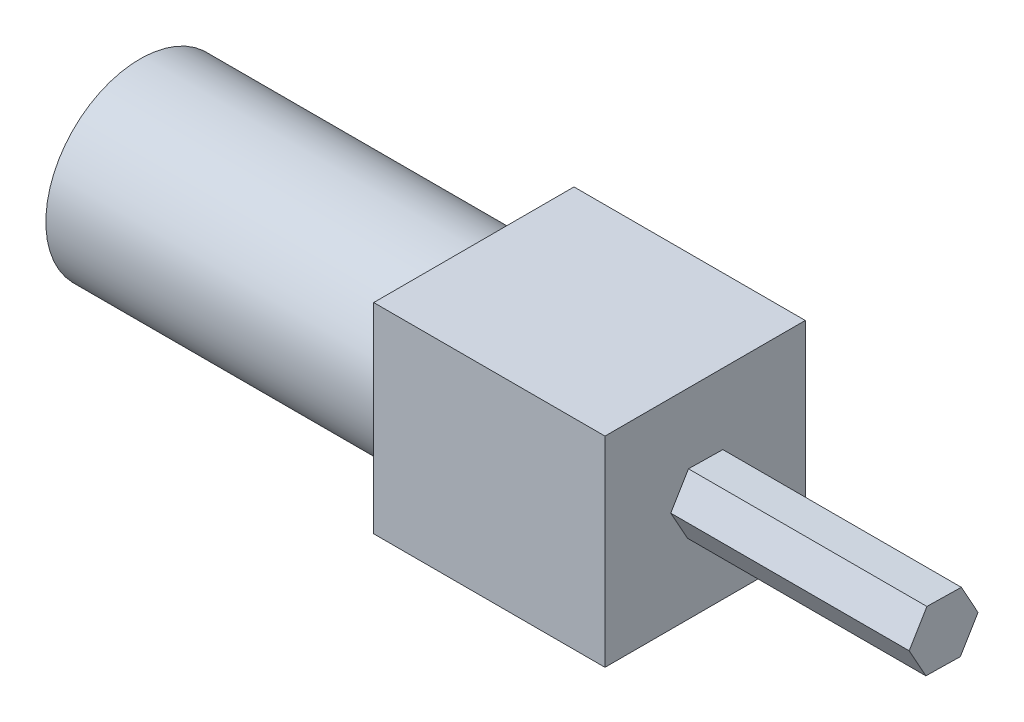
ISO-10303-21;
HEADER;
FILE_DESCRIPTION(('STEP AP214'),'2;1');
FILE_NAME('part.step','',(''),(''),'','','');
FILE_SCHEMA(('AUTOMOTIVE_DESIGN { 1 0 10303 214 1 1 1 1 }'));
ENDSEC;
DATA;
#1=APPLICATION_CONTEXT('core data for automotive mechanical design processes');
#2=APPLICATION_PROTOCOL_DEFINITION('international standard','automotive_design',2000,#1);
#3=PRODUCT_CONTEXT('',#1,'mechanical');
#4=PRODUCT('Part','Part','',(#3));
#5=PRODUCT_RELATED_PRODUCT_CATEGORY('part','',(#4));
#6=PRODUCT_DEFINITION_FORMATION('','',#4);
#7=PRODUCT_DEFINITION_CONTEXT('part definition',#1,'design');
#8=PRODUCT_DEFINITION('design','',#6,#7);
#9=PRODUCT_DEFINITION_SHAPE('','',#8);
#10=(LENGTH_UNIT() NAMED_UNIT(*) SI_UNIT(.MILLI.,.METRE.));
#11=(NAMED_UNIT(*) PLANE_ANGLE_UNIT() SI_UNIT($,.RADIAN.));
#12=(NAMED_UNIT(*) SI_UNIT($,.STERADIAN.) SOLID_ANGLE_UNIT());
#13=UNCERTAINTY_MEASURE_WITH_UNIT(LENGTH_MEASURE(1.E-05),#10,'distance_accuracy_value','');
#14=(GEOMETRIC_REPRESENTATION_CONTEXT(3) GLOBAL_UNCERTAINTY_ASSIGNED_CONTEXT((#13)) GLOBAL_UNIT_ASSIGNED_CONTEXT((#10,
#11,#12)) REPRESENTATION_CONTEXT('',''));
#15=CARTESIAN_POINT('',(0.,0.,0.));
#16=DIRECTION('',(0.,0.,1.));
#17=DIRECTION('',(1.,0.,0.));
#18=AXIS2_PLACEMENT_3D('',#15,#16,#17);
#19=CARTESIAN_POINT('',(120.396,0.,0.));
#20=DIRECTION('',(1.,0.,0.));
#21=DIRECTION('',(0.,0.,-1.));
#22=AXIS2_PLACEMENT_3D('',#19,#20,#21);
#23=PLANE('',#22);
#24=DIRECTION('',(0.,1.,0.));
#25=VECTOR('',#24,1.);
#26=CARTESIAN_POINT('',(120.396,21.336,-21.336));
#27=LINE('',#26,#25);
#28=CARTESIAN_POINT('',(120.396,-21.336,-21.336));
#29=VERTEX_POINT('',#28);
#30=CARTESIAN_POINT('',(120.396,21.336,-21.336));
#31=VERTEX_POINT('',#30);
#32=EDGE_CURVE('E154',#29,#31,#27,.T.);
#33=ORIENTED_EDGE('',*,*,#32,.T.);
#34=DIRECTION('',(0.,0.,1.));
#35=VECTOR('',#34,1.);
#36=CARTESIAN_POINT('',(120.396,21.336,21.336));
#37=LINE('',#36,#35);
#38=CARTESIAN_POINT('',(120.396,21.336,21.336));
#39=VERTEX_POINT('',#38);
#40=EDGE_CURVE('E86',#31,#39,#37,.T.);
#41=ORIENTED_EDGE('',*,*,#40,.T.);
#42=DIRECTION('',(0.,-1.,0.));
#43=VECTOR('',#42,1.);
#44=CARTESIAN_POINT('',(120.396,21.336,21.336));
#45=LINE('',#44,#43);
#46=CARTESIAN_POINT('',(120.396,-21.336,21.336));
#47=VERTEX_POINT('',#46);
#48=EDGE_CURVE('E157',#39,#47,#45,.T.);
#49=ORIENTED_EDGE('',*,*,#48,.T.);
#50=DIRECTION('',(0.,0.,-1.));
#51=VECTOR('',#50,1.);
#52=CARTESIAN_POINT('',(120.396,-21.336,21.336));
#53=LINE('',#52,#51);
#54=EDGE_CURVE('E57',#47,#29,#53,.T.);
#55=ORIENTED_EDGE('',*,*,#54,.T.);
#56=EDGE_LOOP('',(#33,#41,#49,#55));
#57=FACE_BOUND('',#56,.T.);
#58=DIRECTION('',(0.,0.857282029056749,-0.514847086673649));
#59=VECTOR('',#58,1.);
#60=CARTESIAN_POINT('',(120.396,-6.4122242654483,-3.55622177358631));
#61=LINE('',#60,#59);
#62=CARTESIAN_POINT('',(120.396,-6.4122242654483,-3.55622177358631));
#63=VERTEX_POINT('',#62);
#64=CARTESIAN_POINT('',(120.396,-0.126333735307045,-7.33125999543439));
#65=VERTEX_POINT('',#64);
#66=EDGE_CURVE('E326',#63,#65,#61,.T.);
#67=ORIENTED_EDGE('',*,*,#66,.F.);
#68=DIRECTION('',(0.,-0.0172296415954146,-0.999851558707838));
#69=VECTOR('',#68,1.);
#70=CARTESIAN_POINT('',(120.396,-6.28589053014125,3.77503822184808));
#71=LINE('',#70,#69);
#72=CARTESIAN_POINT('',(120.396,-6.28589053014125,3.77503822184808));
#73=VERTEX_POINT('',#72);
#74=EDGE_CURVE('E143',#73,#63,#71,.T.);
#75=ORIENTED_EDGE('',*,*,#74,.F.);
#76=DIRECTION('',(0.,-0.874511670652163,-0.485004472034189));
#77=VECTOR('',#76,1.);
#78=CARTESIAN_POINT('',(120.396,0.126333735307046,7.33125999543439));
#79=LINE('',#78,#77);
#80=CARTESIAN_POINT('',(120.396,0.126333735307046,7.3312599954344));
#81=VERTEX_POINT('',#80);
#82=EDGE_CURVE('E139',#81,#73,#79,.T.);
#83=ORIENTED_EDGE('',*,*,#82,.F.);
#84=DIRECTION('',(0.,-0.857282029056749,0.514847086673649));
#85=VECTOR('',#84,1.);
#86=CARTESIAN_POINT('',(120.396,6.4122242654483,3.55622177358632));
#87=LINE('',#86,#85);
#88=CARTESIAN_POINT('',(120.396,6.4122242654483,3.55622177358632));
#89=VERTEX_POINT('',#88);
#90=EDGE_CURVE('E322',#89,#81,#87,.T.);
#91=ORIENTED_EDGE('',*,*,#90,.F.);
#92=DIRECTION('',(0.,0.0172296415954145,0.999851558707838));
#93=VECTOR('',#92,1.);
#94=CARTESIAN_POINT('',(120.396,6.28589053014125,-3.77503822184807));
#95=LINE('',#94,#93);
#96=CARTESIAN_POINT('',(120.396,6.28589053014125,-3.77503822184807));
#97=VERTEX_POINT('',#96);
#98=EDGE_CURVE('E334',#97,#89,#95,.T.);
#99=ORIENTED_EDGE('',*,*,#98,.F.);
#100=DIRECTION('',(0.,0.874511670652163,0.485004472034189));
#101=VECTOR('',#100,1.);
#102=CARTESIAN_POINT('',(120.396,-0.126333735307045,-7.33125999543439));
#103=LINE('',#102,#101);
#104=EDGE_CURVE('E328',#65,#97,#103,.T.);
#105=ORIENTED_EDGE('',*,*,#104,.F.);
#106=EDGE_LOOP('',(#67,#75,#83,#91,#99,#105));
#107=FACE_BOUND('',#106,.T.);
#108=ADVANCED_FACE('F33',(#57,#107),#23,.T.);
#109=CARTESIAN_POINT('',(71.12,0.,0.));
#110=DIRECTION('',(-1.,0.,0.));
#111=DIRECTION('',(0.,0.,1.));
#112=AXIS2_PLACEMENT_3D('',#109,#110,#111);
#113=CYLINDRICAL_SURFACE('',#112,20.066);
#114=CARTESIAN_POINT('',(71.12,0.,0.));
#115=DIRECTION('',(1.,0.,0.));
#116=DIRECTION('',(0.,0.,-1.));
#117=AXIS2_PLACEMENT_3D('',#114,#115,#116);
#118=CIRCLE('',#117,20.066);
#119=CARTESIAN_POINT('',(71.12,0.,-20.066));
#120=VERTEX_POINT('',#119);
#121=EDGE_CURVE('E11',#120,#120,#118,.T.);
#122=ORIENTED_EDGE('',*,*,#121,.F.);
#123=EDGE_LOOP('',(#122));
#124=FACE_BOUND('',#123,.T.);
#125=CARTESIAN_POINT('',(0.,0.,0.));
#126=DIRECTION('',(1.,0.,0.));
#127=DIRECTION('',(0.,0.,-1.));
#128=AXIS2_PLACEMENT_3D('',#125,#126,#127);
#129=CIRCLE('',#128,20.066);
#130=CARTESIAN_POINT('',(0.,0.,-20.066));
#131=VERTEX_POINT('',#130);
#132=EDGE_CURVE('E37',#131,#131,#129,.T.);
#133=ORIENTED_EDGE('',*,*,#132,.T.);
#134=EDGE_LOOP('',(#133));
#135=FACE_BOUND('',#134,.T.);
#136=ADVANCED_FACE('F35',(#124,#135),#113,.T.);
#137=CARTESIAN_POINT('',(0.,0.,0.));
#138=DIRECTION('',(1.,0.,0.));
#139=DIRECTION('',(0.,0.,-1.));
#140=AXIS2_PLACEMENT_3D('',#137,#138,#139);
#141=PLANE('',#140);
#142=ORIENTED_EDGE('',*,*,#132,.F.);
#143=EDGE_LOOP('',(#142));
#144=FACE_BOUND('',#143,.T.);
#145=ADVANCED_FACE('F177',(#144),#141,.F.);
#146=CARTESIAN_POINT('',(120.396,21.336,-21.336));
#147=DIRECTION('',(0.,0.,1.));
#148=DIRECTION('',(0.,-1.,0.));
#149=AXIS2_PLACEMENT_3D('',#146,#147,#148);
#150=PLANE('',#149);
#151=DIRECTION('',(0.,1.,0.));
#152=VECTOR('',#151,1.);
#153=CARTESIAN_POINT('',(71.12,21.336,-21.336));
#154=LINE('',#153,#152);
#155=CARTESIAN_POINT('',(71.12,-21.336,-21.336));
#156=VERTEX_POINT('',#155);
#157=CARTESIAN_POINT('',(71.12,21.336,-21.336));
#158=VERTEX_POINT('',#157);
#159=EDGE_CURVE('E145',#156,#158,#154,.T.);
#160=ORIENTED_EDGE('',*,*,#159,.T.);
#161=DIRECTION('',(-1.,0.,0.));
#162=VECTOR('',#161,1.);
#163=CARTESIAN_POINT('',(120.396,21.336,-21.336));
#164=LINE('',#163,#162);
#165=EDGE_CURVE('E171',#31,#158,#164,.T.);
#166=ORIENTED_EDGE('',*,*,#165,.F.);
#167=ORIENTED_EDGE('',*,*,#32,.F.);
#168=DIRECTION('',(-1.,0.,0.));
#169=VECTOR('',#168,1.);
#170=CARTESIAN_POINT('',(120.396,-21.336,-21.336));
#171=LINE('',#170,#169);
#172=EDGE_CURVE('E159',#29,#156,#171,.T.);
#173=ORIENTED_EDGE('',*,*,#172,.T.);
#174=EDGE_LOOP('',(#160,#166,#167,#173));
#175=FACE_BOUND('',#174,.T.);
#176=ADVANCED_FACE('F179',(#175),#150,.F.);
#177=CARTESIAN_POINT('',(120.396,21.336,21.336));
#178=DIRECTION('',(0.,-1.,0.));
#179=DIRECTION('',(0.,0.,-1.));
#180=AXIS2_PLACEMENT_3D('',#177,#178,#179);
#181=PLANE('',#180);
#182=DIRECTION('',(0.,0.,1.));
#183=VECTOR('',#182,1.);
#184=CARTESIAN_POINT('',(71.12,21.336,21.336));
#185=LINE('',#184,#183);
#186=CARTESIAN_POINT('',(71.12,21.336,21.336));
#187=VERTEX_POINT('',#186);
#188=EDGE_CURVE('E148',#158,#187,#185,.T.);
#189=ORIENTED_EDGE('',*,*,#188,.T.);
#190=DIRECTION('',(-1.,0.,0.));
#191=VECTOR('',#190,1.);
#192=CARTESIAN_POINT('',(120.396,21.336,21.336));
#193=LINE('',#192,#191);
#194=EDGE_CURVE('E168',#39,#187,#193,.T.);
#195=ORIENTED_EDGE('',*,*,#194,.F.);
#196=ORIENTED_EDGE('',*,*,#40,.F.);
#197=ORIENTED_EDGE('',*,*,#165,.T.);
#198=EDGE_LOOP('',(#189,#195,#196,#197));
#199=FACE_BOUND('',#198,.T.);
#200=ADVANCED_FACE('F184',(#199),#181,.F.);
#201=CARTESIAN_POINT('',(120.396,21.336,21.336));
#202=DIRECTION('',(0.,0.,-1.));
#203=DIRECTION('',(0.,1.,0.));
#204=AXIS2_PLACEMENT_3D('',#201,#202,#203);
#205=PLANE('',#204);
#206=DIRECTION('',(0.,-1.,0.));
#207=VECTOR('',#206,1.);
#208=CARTESIAN_POINT('',(71.12,21.336,21.336));
#209=LINE('',#208,#207);
#210=CARTESIAN_POINT('',(71.12,-21.336,21.336));
#211=VERTEX_POINT('',#210);
#212=EDGE_CURVE('E162',#187,#211,#209,.T.);
#213=ORIENTED_EDGE('',*,*,#212,.T.);
#214=DIRECTION('',(-1.,0.,0.));
#215=VECTOR('',#214,1.);
#216=CARTESIAN_POINT('',(120.396,-21.336,21.336));
#217=LINE('',#216,#215);
#218=EDGE_CURVE('E166',#47,#211,#217,.T.);
#219=ORIENTED_EDGE('',*,*,#218,.F.);
#220=ORIENTED_EDGE('',*,*,#48,.F.);
#221=ORIENTED_EDGE('',*,*,#194,.T.);
#222=EDGE_LOOP('',(#213,#219,#220,#221));
#223=FACE_BOUND('',#222,.T.);
#224=ADVANCED_FACE('F203',(#223),#205,.F.);
#225=CARTESIAN_POINT('',(120.396,-21.336,21.336));
#226=DIRECTION('',(0.,1.,0.));
#227=DIRECTION('',(0.,0.,1.));
#228=AXIS2_PLACEMENT_3D('',#225,#226,#227);
#229=PLANE('',#228);
#230=DIRECTION('',(0.,0.,-1.));
#231=VECTOR('',#230,1.);
#232=CARTESIAN_POINT('',(71.12,-21.336,21.336));
#233=LINE('',#232,#231);
#234=EDGE_CURVE('E78',#211,#156,#233,.T.);
#235=ORIENTED_EDGE('',*,*,#234,.T.);
#236=ORIENTED_EDGE('',*,*,#172,.F.);
#237=ORIENTED_EDGE('',*,*,#54,.F.);
#238=ORIENTED_EDGE('',*,*,#218,.T.);
#239=EDGE_LOOP('',(#235,#236,#237,#238));
#240=FACE_BOUND('',#239,.T.);
#241=ADVANCED_FACE('F199',(#240),#229,.F.);
#242=CARTESIAN_POINT('',(71.12,0.,0.));
#243=DIRECTION('',(1.,0.,0.));
#244=DIRECTION('',(0.,0.,-1.));
#245=AXIS2_PLACEMENT_3D('',#242,#243,#244);
#246=PLANE('',#245);
#247=ORIENTED_EDGE('',*,*,#121,.T.);
#248=EDGE_LOOP('',(#247));
#249=FACE_BOUND('',#248,.T.);
#250=ORIENTED_EDGE('',*,*,#159,.F.);
#251=ORIENTED_EDGE('',*,*,#234,.F.);
#252=ORIENTED_EDGE('',*,*,#212,.F.);
#253=ORIENTED_EDGE('',*,*,#188,.F.);
#254=EDGE_LOOP('',(#250,#251,#252,#253));
#255=FACE_BOUND('',#254,.T.);
#256=ADVANCED_FACE('F196',(#249,#255),#246,.F.);
#257=CARTESIAN_POINT('',(171.196,-6.28589053014125,3.77503822184808));
#258=DIRECTION('',(0.,0.999851558707838,-0.0172296415954146));
#259=DIRECTION('',(0.,0.0172296415954146,0.999851558707838));
#260=AXIS2_PLACEMENT_3D('',#257,#258,#259);
#261=PLANE('',#260);
#262=ORIENTED_EDGE('',*,*,#74,.T.);
#263=DIRECTION('',(-1.,0.,0.));
#264=VECTOR('',#263,1.);
#265=CARTESIAN_POINT('',(171.196,-6.4122242654483,-3.55622177358631));
#266=LINE('',#265,#264);
#267=CARTESIAN_POINT('',(171.196,-6.4122242654483,-3.55622177358631));
#268=VERTEX_POINT('',#267);
#269=EDGE_CURVE('E124',#268,#63,#266,.T.);
#270=ORIENTED_EDGE('',*,*,#269,.F.);
#271=DIRECTION('',(0.,-0.0172296415954146,-0.999851558707838));
#272=VECTOR('',#271,1.);
#273=CARTESIAN_POINT('',(171.196,-6.28589053014125,3.77503822184808));
#274=LINE('',#273,#272);
#275=CARTESIAN_POINT('',(171.196,-6.28589053014125,3.77503822184808));
#276=VERTEX_POINT('',#275);
#277=EDGE_CURVE('E131',#276,#268,#274,.T.);
#278=ORIENTED_EDGE('',*,*,#277,.F.);
#279=DIRECTION('',(-1.,0.,0.));
#280=VECTOR('',#279,1.);
#281=CARTESIAN_POINT('',(171.196,-6.28589053014125,3.77503822184808));
#282=LINE('',#281,#280);
#283=EDGE_CURVE('E320',#276,#73,#282,.T.);
#284=ORIENTED_EDGE('',*,*,#283,.T.);
#285=EDGE_LOOP('',(#262,#270,#278,#284));
#286=FACE_BOUND('',#285,.T.);
#287=ADVANCED_FACE('F141',(#286),#261,.F.);
#288=CARTESIAN_POINT('',(171.196,-6.4122242654483,-3.55622177358631));
#289=DIRECTION('',(0.,0.514847086673649,0.857282029056749));
#290=DIRECTION('',(0.,-0.857282029056749,0.514847086673649));
#291=AXIS2_PLACEMENT_3D('',#288,#289,#290);
#292=PLANE('',#291);
#293=ORIENTED_EDGE('',*,*,#66,.T.);
#294=DIRECTION('',(-1.,0.,0.));
#295=VECTOR('',#294,1.);
#296=CARTESIAN_POINT('',(171.196,-0.126333735307045,-7.33125999543439));
#297=LINE('',#296,#295);
#298=CARTESIAN_POINT('',(171.196,-0.126333735307045,-7.33125999543439));
#299=VERTEX_POINT('',#298);
#300=EDGE_CURVE('E127',#299,#65,#297,.T.);
#301=ORIENTED_EDGE('',*,*,#300,.F.);
#302=DIRECTION('',(0.,0.857282029056749,-0.514847086673649));
#303=VECTOR('',#302,1.);
#304=CARTESIAN_POINT('',(171.196,-6.4122242654483,-3.55622177358631));
#305=LINE('',#304,#303);
#306=EDGE_CURVE('E120',#268,#299,#305,.T.);
#307=ORIENTED_EDGE('',*,*,#306,.F.);
#308=ORIENTED_EDGE('',*,*,#269,.T.);
#309=EDGE_LOOP('',(#293,#301,#307,#308));
#310=FACE_BOUND('',#309,.T.);
#311=ADVANCED_FACE('F122',(#310),#292,.F.);
#312=CARTESIAN_POINT('',(171.196,-0.126333735307045,-7.33125999543439));
#313=DIRECTION('',(0.,-0.485004472034189,0.874511670652163));
#314=DIRECTION('',(0.,-0.874511670652163,-0.485004472034189));
#315=AXIS2_PLACEMENT_3D('',#312,#313,#314);
#316=PLANE('',#315);
#317=ORIENTED_EDGE('',*,*,#104,.T.);
#318=DIRECTION('',(-1.,0.,0.));
#319=VECTOR('',#318,1.);
#320=CARTESIAN_POINT('',(171.196,6.28589053014125,-3.77503822184807));
#321=LINE('',#320,#319);
#322=CARTESIAN_POINT('',(171.196,6.28589053014125,-3.77503822184807));
#323=VERTEX_POINT('',#322);
#324=EDGE_CURVE('E150',#323,#97,#321,.T.);
#325=ORIENTED_EDGE('',*,*,#324,.F.);
#326=DIRECTION('',(0.,0.874511670652163,0.485004472034189));
#327=VECTOR('',#326,1.);
#328=CARTESIAN_POINT('',(171.196,-0.126333735307045,-7.33125999543439));
#329=LINE('',#328,#327);
#330=EDGE_CURVE('E130',#299,#323,#329,.T.);
#331=ORIENTED_EDGE('',*,*,#330,.F.);
#332=ORIENTED_EDGE('',*,*,#300,.T.);
#333=EDGE_LOOP('',(#317,#325,#331,#332));
#334=FACE_BOUND('',#333,.T.);
#335=ADVANCED_FACE('F241',(#334),#316,.F.);
#336=CARTESIAN_POINT('',(171.196,6.28589053014125,-3.77503822184807));
#337=DIRECTION('',(0.,-0.999851558707838,0.0172296415954145));
#338=DIRECTION('',(0.,-0.0172296415954145,-0.999851558707838));
#339=AXIS2_PLACEMENT_3D('',#336,#337,#338);
#340=PLANE('',#339);
#341=ORIENTED_EDGE('',*,*,#98,.T.);
#342=DIRECTION('',(-1.,0.,0.));
#343=VECTOR('',#342,1.);
#344=CARTESIAN_POINT('',(171.196,6.4122242654483,3.55622177358632));
#345=LINE('',#344,#343);
#346=CARTESIAN_POINT('',(171.196,6.4122242654483,3.55622177358632));
#347=VERTEX_POINT('',#346);
#348=EDGE_CURVE('E338',#347,#89,#345,.T.);
#349=ORIENTED_EDGE('',*,*,#348,.F.);
#350=DIRECTION('',(0.,0.0172296415954145,0.999851558707838));
#351=VECTOR('',#350,1.);
#352=CARTESIAN_POINT('',(171.196,6.28589053014125,-3.77503822184807));
#353=LINE('',#352,#351);
#354=EDGE_CURVE('E345',#323,#347,#353,.T.);
#355=ORIENTED_EDGE('',*,*,#354,.F.);
#356=ORIENTED_EDGE('',*,*,#324,.T.);
#357=EDGE_LOOP('',(#341,#349,#355,#356));
#358=FACE_BOUND('',#357,.T.);
#359=ADVANCED_FACE('F247',(#358),#340,.F.);
#360=CARTESIAN_POINT('',(171.196,6.4122242654483,3.55622177358632));
#361=DIRECTION('',(0.,-0.514847086673649,-0.857282029056749));
#362=DIRECTION('',(0.,0.857282029056749,-0.514847086673649));
#363=AXIS2_PLACEMENT_3D('',#360,#361,#362);
#364=PLANE('',#363);
#365=ORIENTED_EDGE('',*,*,#90,.T.);
#366=DIRECTION('',(-1.,0.,0.));
#367=VECTOR('',#366,1.);
#368=CARTESIAN_POINT('',(171.196,0.126333735307046,7.33125999543439));
#369=LINE('',#368,#367);
#370=CARTESIAN_POINT('',(171.196,0.126333735307046,7.33125999543439));
#371=VERTEX_POINT('',#370);
#372=EDGE_CURVE('E48',#371,#81,#369,.T.);
#373=ORIENTED_EDGE('',*,*,#372,.F.);
#374=DIRECTION('',(0.,-0.857282029056749,0.514847086673649));
#375=VECTOR('',#374,1.);
#376=CARTESIAN_POINT('',(171.196,6.4122242654483,3.55622177358632));
#377=LINE('',#376,#375);
#378=EDGE_CURVE('E347',#347,#371,#377,.T.);
#379=ORIENTED_EDGE('',*,*,#378,.F.);
#380=ORIENTED_EDGE('',*,*,#348,.T.);
#381=EDGE_LOOP('',(#365,#373,#379,#380));
#382=FACE_BOUND('',#381,.T.);
#383=ADVANCED_FACE('F255',(#382),#364,.F.);
#384=CARTESIAN_POINT('',(171.196,0.126333735307046,7.33125999543439));
#385=DIRECTION('',(0.,0.485004472034189,-0.874511670652163));
#386=DIRECTION('',(0.,0.874511670652163,0.485004472034189));
#387=AXIS2_PLACEMENT_3D('',#384,#385,#386);
#388=PLANE('',#387);
#389=ORIENTED_EDGE('',*,*,#82,.T.);
#390=ORIENTED_EDGE('',*,*,#283,.F.);
#391=DIRECTION('',(0.,-0.874511670652163,-0.485004472034189));
#392=VECTOR('',#391,1.);
#393=CARTESIAN_POINT('',(171.196,0.126333735307046,7.33125999543439));
#394=LINE('',#393,#392);
#395=EDGE_CURVE('E135',#371,#276,#394,.T.);
#396=ORIENTED_EDGE('',*,*,#395,.F.);
#397=ORIENTED_EDGE('',*,*,#372,.T.);
#398=EDGE_LOOP('',(#389,#390,#396,#397));
#399=FACE_BOUND('',#398,.T.);
#400=ADVANCED_FACE('F263',(#399),#388,.F.);
#401=CARTESIAN_POINT('',(171.196,0.,0.));
#402=DIRECTION('',(1.,0.,0.));
#403=DIRECTION('',(0.,0.,-1.));
#404=AXIS2_PLACEMENT_3D('',#401,#402,#403);
#405=PLANE('',#404);
#406=ORIENTED_EDGE('',*,*,#277,.T.);
#407=ORIENTED_EDGE('',*,*,#306,.T.);
#408=ORIENTED_EDGE('',*,*,#330,.T.);
#409=ORIENTED_EDGE('',*,*,#354,.T.);
#410=ORIENTED_EDGE('',*,*,#378,.T.);
#411=ORIENTED_EDGE('',*,*,#395,.T.);
#412=EDGE_LOOP('',(#406,#407,#408,#409,#410,#411));
#413=FACE_BOUND('',#412,.T.);
#414=ADVANCED_FACE('F134',(#413),#405,.T.);
#415=CLOSED_SHELL('',(#108,#136,#145,#176,#200,#224,#241,#256,#287,#311,#335,#359,#383,#400,#414));
#416=MANIFOLD_SOLID_BREP('B2',#415);
#417=ADVANCED_BREP_SHAPE_REPRESENTATION('',(#18,#416),#14);
#418=SHAPE_DEFINITION_REPRESENTATION(#9,#417);
ENDSEC;
END-ISO-10303-21;
